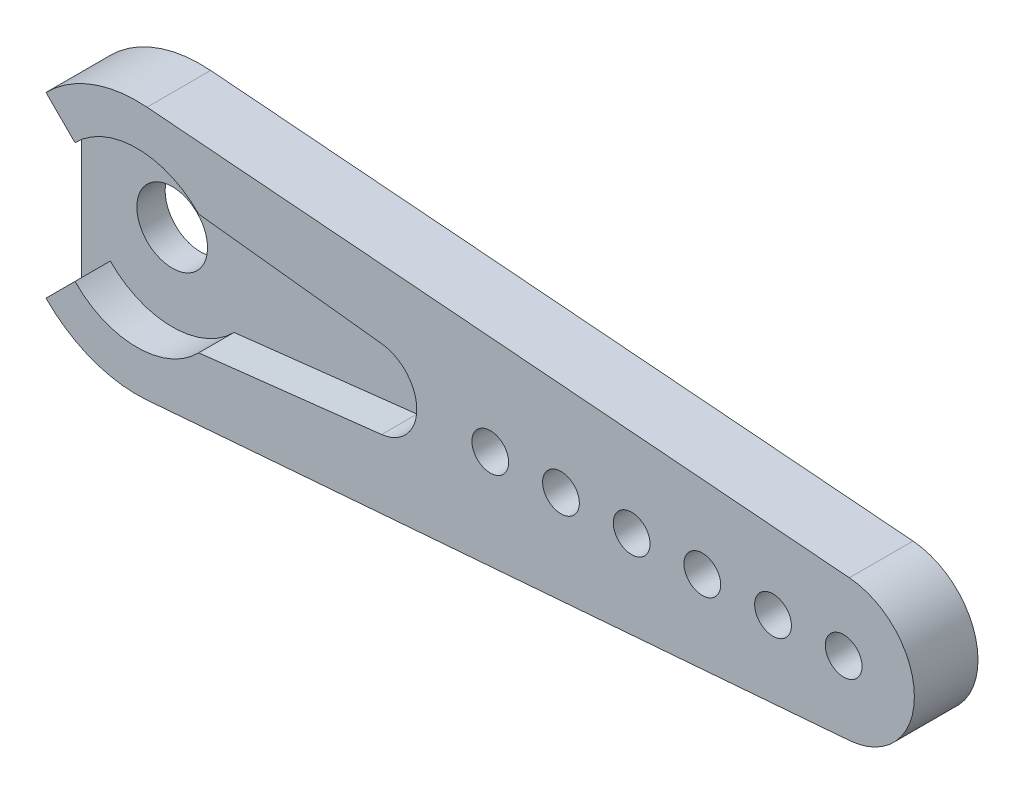
ISO-10303-21;
HEADER;
FILE_DESCRIPTION(('STEP AP214'),'2;1');
FILE_NAME('part.step','',(''),(''),'','','');
FILE_SCHEMA(('AUTOMOTIVE_DESIGN { 1 0 10303 214 1 1 1 1 }'));
ENDSEC;
DATA;
#1=APPLICATION_CONTEXT('core data for automotive mechanical design processes');
#2=APPLICATION_PROTOCOL_DEFINITION('international standard','automotive_design',2000,#1);
#3=PRODUCT_CONTEXT('',#1,'mechanical');
#4=PRODUCT('Part','Part','',(#3));
#5=PRODUCT_RELATED_PRODUCT_CATEGORY('part','',(#4));
#6=PRODUCT_DEFINITION_FORMATION('','',#4);
#7=PRODUCT_DEFINITION_CONTEXT('part definition',#1,'design');
#8=PRODUCT_DEFINITION('design','',#6,#7);
#9=PRODUCT_DEFINITION_SHAPE('','',#8);
#10=(LENGTH_UNIT() NAMED_UNIT(*) SI_UNIT(.MILLI.,.METRE.));
#11=(NAMED_UNIT(*) PLANE_ANGLE_UNIT() SI_UNIT($,.RADIAN.));
#12=(NAMED_UNIT(*) SI_UNIT($,.STERADIAN.) SOLID_ANGLE_UNIT());
#13=UNCERTAINTY_MEASURE_WITH_UNIT(LENGTH_MEASURE(1.E-05),#10,'distance_accuracy_value','');
#14=(GEOMETRIC_REPRESENTATION_CONTEXT(3) GLOBAL_UNCERTAINTY_ASSIGNED_CONTEXT((#13)) GLOBAL_UNIT_ASSIGNED_CONTEXT((#10,
#11,#12)) REPRESENTATION_CONTEXT('',''));
#15=CARTESIAN_POINT('',(0.,0.,0.));
#16=DIRECTION('',(0.,0.,1.));
#17=DIRECTION('',(1.,0.,0.));
#18=AXIS2_PLACEMENT_3D('',#15,#16,#17);
#19=CARTESIAN_POINT('',(25.,0.,-2.));
#20=DIRECTION('',(0.,0.,1.));
#21=DIRECTION('',(1.,0.,0.));
#22=AXIS2_PLACEMENT_3D('',#19,#20,#21);
#23=CYLINDRICAL_SURFACE('',#22,1.3);
#24=CARTESIAN_POINT('',(25.,0.,-2.));
#25=DIRECTION('',(0.,0.,1.));
#26=DIRECTION('',(1.,0.,0.));
#27=AXIS2_PLACEMENT_3D('',#24,#25,#26);
#28=CIRCLE('',#27,1.3);
#29=CARTESIAN_POINT('',(26.3,0.,-2.));
#30=VERTEX_POINT('',#29);
#31=EDGE_CURVE('E41',#30,#30,#28,.T.);
#32=ORIENTED_EDGE('',*,*,#31,.F.);
#33=EDGE_LOOP('',(#32));
#34=FACE_BOUND('',#33,.T.);
#35=CARTESIAN_POINT('',(25.,0.,2.5));
#36=DIRECTION('',(0.,0.,1.));
#37=DIRECTION('',(1.,0.,0.));
#38=AXIS2_PLACEMENT_3D('',#35,#36,#37);
#39=CIRCLE('',#38,1.3);
#40=CARTESIAN_POINT('',(26.3,0.,2.5));
#41=VERTEX_POINT('',#40);
#42=EDGE_CURVE('E11',#41,#41,#39,.T.);
#43=ORIENTED_EDGE('',*,*,#42,.T.);
#44=EDGE_LOOP('',(#43));
#45=FACE_BOUND('',#44,.T.);
#46=ADVANCED_FACE('F33',(#34,#45),#23,.F.);
#47=CARTESIAN_POINT('',(30.,0.,-2.));
#48=DIRECTION('',(0.,0.,1.));
#49=DIRECTION('',(1.,0.,0.));
#50=AXIS2_PLACEMENT_3D('',#47,#48,#49);
#51=CYLINDRICAL_SURFACE('',#50,1.3);
#52=CARTESIAN_POINT('',(30.,0.,-2.));
#53=DIRECTION('',(0.,0.,1.));
#54=DIRECTION('',(1.,0.,0.));
#55=AXIS2_PLACEMENT_3D('',#52,#53,#54);
#56=CIRCLE('',#55,1.3);
#57=CARTESIAN_POINT('',(31.3,0.,-2.));
#58=VERTEX_POINT('',#57);
#59=EDGE_CURVE('E243',#58,#58,#56,.T.);
#60=ORIENTED_EDGE('',*,*,#59,.F.);
#61=EDGE_LOOP('',(#60));
#62=FACE_BOUND('',#61,.T.);
#63=CARTESIAN_POINT('',(30.,0.,2.5));
#64=DIRECTION('',(0.,0.,1.));
#65=DIRECTION('',(1.,0.,0.));
#66=AXIS2_PLACEMENT_3D('',#63,#64,#65);
#67=CIRCLE('',#66,1.3);
#68=CARTESIAN_POINT('',(31.3,0.,2.5));
#69=VERTEX_POINT('',#68);
#70=EDGE_CURVE('E246',#69,#69,#67,.T.);
#71=ORIENTED_EDGE('',*,*,#70,.T.);
#72=EDGE_LOOP('',(#71));
#73=FACE_BOUND('',#72,.T.);
#74=ADVANCED_FACE('F254',(#62,#73),#51,.F.);
#75=CARTESIAN_POINT('',(35.,0.,-2.));
#76=DIRECTION('',(0.,0.,1.));
#77=DIRECTION('',(1.,0.,0.));
#78=AXIS2_PLACEMENT_3D('',#75,#76,#77);
#79=CYLINDRICAL_SURFACE('',#78,1.3);
#80=CARTESIAN_POINT('',(35.,0.,-2.));
#81=DIRECTION('',(0.,0.,1.));
#82=DIRECTION('',(1.,0.,0.));
#83=AXIS2_PLACEMENT_3D('',#80,#81,#82);
#84=CIRCLE('',#83,1.3);
#85=CARTESIAN_POINT('',(36.3,0.,-2.));
#86=VERTEX_POINT('',#85);
#87=EDGE_CURVE('E237',#86,#86,#84,.T.);
#88=ORIENTED_EDGE('',*,*,#87,.F.);
#89=EDGE_LOOP('',(#88));
#90=FACE_BOUND('',#89,.T.);
#91=CARTESIAN_POINT('',(35.,0.,2.5));
#92=DIRECTION('',(0.,0.,1.));
#93=DIRECTION('',(1.,0.,0.));
#94=AXIS2_PLACEMENT_3D('',#91,#92,#93);
#95=CIRCLE('',#94,1.3);
#96=CARTESIAN_POINT('',(36.3,0.,2.5));
#97=VERTEX_POINT('',#96);
#98=EDGE_CURVE('E240',#97,#97,#95,.T.);
#99=ORIENTED_EDGE('',*,*,#98,.T.);
#100=EDGE_LOOP('',(#99));
#101=FACE_BOUND('',#100,.T.);
#102=ADVANCED_FACE('F321',(#90,#101),#79,.F.);
#103=CARTESIAN_POINT('',(40.,0.,-2.));
#104=DIRECTION('',(0.,0.,1.));
#105=DIRECTION('',(1.,0.,0.));
#106=AXIS2_PLACEMENT_3D('',#103,#104,#105);
#107=CYLINDRICAL_SURFACE('',#106,1.3);
#108=CARTESIAN_POINT('',(40.,0.,-2.));
#109=DIRECTION('',(0.,0.,1.));
#110=DIRECTION('',(1.,0.,0.));
#111=AXIS2_PLACEMENT_3D('',#108,#109,#110);
#112=CIRCLE('',#111,1.3);
#113=CARTESIAN_POINT('',(41.3,0.,-2.));
#114=VERTEX_POINT('',#113);
#115=EDGE_CURVE('E231',#114,#114,#112,.T.);
#116=ORIENTED_EDGE('',*,*,#115,.F.);
#117=EDGE_LOOP('',(#116));
#118=FACE_BOUND('',#117,.T.);
#119=CARTESIAN_POINT('',(40.,0.,2.5));
#120=DIRECTION('',(0.,0.,1.));
#121=DIRECTION('',(1.,0.,0.));
#122=AXIS2_PLACEMENT_3D('',#119,#120,#121);
#123=CIRCLE('',#122,1.3);
#124=CARTESIAN_POINT('',(41.3,0.,2.5));
#125=VERTEX_POINT('',#124);
#126=EDGE_CURVE('E234',#125,#125,#123,.T.);
#127=ORIENTED_EDGE('',*,*,#126,.T.);
#128=EDGE_LOOP('',(#127));
#129=FACE_BOUND('',#128,.T.);
#130=ADVANCED_FACE('F318',(#118,#129),#107,.F.);
#131=CARTESIAN_POINT('',(0.,0.,2.5));
#132=DIRECTION('',(0.,0.,-1.));
#133=DIRECTION('',(-1.,0.,0.));
#134=AXIS2_PLACEMENT_3D('',#131,#132,#133);
#135=CYLINDRICAL_SURFACE('',#134,9.);
#136=DIRECTION('',(0.,0.,-1.));
#137=VECTOR('',#136,1.);
#138=CARTESIAN_POINT('',(0.719999999999999,8.97115377195152,2.5));
#139=LINE('',#138,#137);
#140=CARTESIAN_POINT('',(0.719999999999999,8.97115377195152,2.5));
#141=VERTEX_POINT('',#140);
#142=CARTESIAN_POINT('',(0.719999999999999,8.97115377195152,-2.));
#143=VERTEX_POINT('',#142);
#144=EDGE_CURVE('E185',#141,#143,#139,.T.);
#145=ORIENTED_EDGE('',*,*,#144,.T.);
#146=CARTESIAN_POINT('',(0.,0.,-2.));
#147=DIRECTION('',(0.,0.,-1.));
#148=DIRECTION('',(-1.,0.,0.));
#149=AXIS2_PLACEMENT_3D('',#146,#147,#148);
#150=CIRCLE('',#149,9.);
#151=CARTESIAN_POINT('',(-6.42654307097902,6.30075742723457,-2.));
#152=VERTEX_POINT('',#151);
#153=EDGE_CURVE('E135',#152,#143,#150,.T.);
#154=ORIENTED_EDGE('',*,*,#153,.F.);
#155=DIRECTION('',(0.,0.,1.));
#156=VECTOR('',#155,1.);
#157=CARTESIAN_POINT('',(-6.42654307097902,6.30075742723457,-2.));
#158=LINE('',#157,#156);
#159=CARTESIAN_POINT('',(-6.42654307097902,6.30075742723457,0.));
#160=VERTEX_POINT('',#159);
#161=EDGE_CURVE('E131',#152,#160,#158,.T.);
#162=ORIENTED_EDGE('',*,*,#161,.T.);
#163=DIRECTION('',(0.,0.,-1.));
#164=VECTOR('',#163,1.);
#165=CARTESIAN_POINT('',(-6.42654307097901,6.30075742723457,2.5));
#166=LINE('',#165,#164);
#167=CARTESIAN_POINT('',(-6.42654307097901,6.30075742723457,2.5));
#168=VERTEX_POINT('',#167);
#169=EDGE_CURVE('E228',#168,#160,#166,.T.);
#170=ORIENTED_EDGE('',*,*,#169,.F.);
#171=CARTESIAN_POINT('',(0.,0.,2.5));
#172=DIRECTION('',(0.,0.,1.));
#173=DIRECTION('',(-1.,0.,0.));
#174=AXIS2_PLACEMENT_3D('',#171,#172,#173);
#175=CIRCLE('',#174,9.);
#176=EDGE_CURVE('E162',#141,#168,#175,.T.);
#177=ORIENTED_EDGE('',*,*,#176,.F.);
#178=EDGE_LOOP('',(#145,#154,#162,#170,#177));
#179=FACE_BOUND('',#178,.T.);
#180=ADVANCED_FACE('F314',(#179),#135,.T.);
#181=CARTESIAN_POINT('',(-4.37578564374445,4.25,2.5));
#182=DIRECTION('',(0.707106781186548,0.707106781186548,0.));
#183=DIRECTION('',(-0.707106781186548,0.707106781186548,0.));
#184=AXIS2_PLACEMENT_3D('',#181,#182,#183);
#185=PLANE('',#184);
#186=DIRECTION('',(0.707106781186548,-0.707106781186548,0.));
#187=VECTOR('',#186,1.);
#188=CARTESIAN_POINT('',(-4.37578564374445,4.25,0.));
#189=LINE('',#188,#187);
#190=CARTESIAN_POINT('',(-4.37578564374445,4.25,0.));
#191=VERTEX_POINT('',#190);
#192=EDGE_CURVE('E154',#160,#191,#189,.T.);
#193=ORIENTED_EDGE('',*,*,#192,.T.);
#194=DIRECTION('',(0.,0.,-1.));
#195=VECTOR('',#194,1.);
#196=CARTESIAN_POINT('',(-4.37578564374445,4.25,2.5));
#197=LINE('',#196,#195);
#198=CARTESIAN_POINT('',(-4.37578564374445,4.25,2.5));
#199=VERTEX_POINT('',#198);
#200=EDGE_CURVE('E225',#199,#191,#197,.T.);
#201=ORIENTED_EDGE('',*,*,#200,.F.);
#202=DIRECTION('',(0.707106781186548,-0.707106781186548,0.));
#203=VECTOR('',#202,1.);
#204=CARTESIAN_POINT('',(-4.37578564374445,4.25,2.5));
#205=LINE('',#204,#203);
#206=EDGE_CURVE('E164',#168,#199,#205,.T.);
#207=ORIENTED_EDGE('',*,*,#206,.F.);
#208=ORIENTED_EDGE('',*,*,#169,.T.);
#209=EDGE_LOOP('',(#193,#201,#207,#208));
#210=FACE_BOUND('',#209,.T.);
#211=ADVANCED_FACE('F310',(#210),#185,.F.);
#212=CARTESIAN_POINT('',(0.,0.,2.5));
#213=DIRECTION('',(0.,0.,-1.));
#214=DIRECTION('',(-1.,0.,0.));
#215=AXIS2_PLACEMENT_3D('',#212,#213,#214);
#216=CYLINDRICAL_SURFACE('',#215,6.1);
#217=CARTESIAN_POINT('',(0.,0.,0.));
#218=DIRECTION('',(0.,0.,-1.));
#219=DIRECTION('',(1.,0.,0.));
#220=AXIS2_PLACEMENT_3D('',#217,#218,#219);
#221=CIRCLE('',#220,6.1);
#222=CARTESIAN_POINT('',(4.37578564374445,4.25,0.));
#223=VERTEX_POINT('',#222);
#224=EDGE_CURVE('E157',#191,#223,#221,.T.);
#225=ORIENTED_EDGE('',*,*,#224,.T.);
#226=DIRECTION('',(0.,0.,-1.));
#227=VECTOR('',#226,1.);
#228=CARTESIAN_POINT('',(4.37578564374445,4.25,2.5));
#229=LINE('',#228,#227);
#230=CARTESIAN_POINT('',(4.37578564374445,4.25,2.5));
#231=VERTEX_POINT('',#230);
#232=EDGE_CURVE('E222',#231,#223,#229,.T.);
#233=ORIENTED_EDGE('',*,*,#232,.F.);
#234=CARTESIAN_POINT('',(0.,0.,2.5));
#235=DIRECTION('',(0.,0.,-1.));
#236=DIRECTION('',(1.,0.,0.));
#237=AXIS2_PLACEMENT_3D('',#234,#235,#236);
#238=CIRCLE('',#237,6.1);
#239=EDGE_CURVE('E167',#199,#231,#238,.T.);
#240=ORIENTED_EDGE('',*,*,#239,.F.);
#241=ORIENTED_EDGE('',*,*,#200,.T.);
#242=EDGE_LOOP('',(#225,#233,#240,#241));
#243=FACE_BOUND('',#242,.T.);
#244=ADVANCED_FACE('F306',(#243),#216,.F.);
#245=CARTESIAN_POINT('',(4.37578564374445,4.25,2.5));
#246=DIRECTION('',(0.112713317991759,0.993627549913592,0.));
#247=DIRECTION('',(-0.993627549913592,0.112713317991759,0.));
#248=AXIS2_PLACEMENT_3D('',#245,#246,#247);
#249=PLANE('',#248);
#250=DIRECTION('',(0.993627549913592,-0.112713317991759,0.));
#251=VECTOR('',#250,1.);
#252=CARTESIAN_POINT('',(4.37578564374445,4.25,0.));
#253=LINE('',#252,#251);
#254=CARTESIAN_POINT('',(17.3155972903769,2.78215713975806,0.));
#255=VERTEX_POINT('',#254);
#256=EDGE_CURVE('E189',#223,#255,#253,.T.);
#257=ORIENTED_EDGE('',*,*,#256,.T.);
#258=DIRECTION('',(0.,0.,-1.));
#259=VECTOR('',#258,1.);
#260=CARTESIAN_POINT('',(17.3155972903769,2.78215713975806,2.5));
#261=LINE('',#260,#259);
#262=CARTESIAN_POINT('',(17.3155972903769,2.78215713975806,2.5));
#263=VERTEX_POINT('',#262);
#264=EDGE_CURVE('E219',#263,#255,#261,.T.);
#265=ORIENTED_EDGE('',*,*,#264,.F.);
#266=DIRECTION('',(0.993627549913592,-0.112713317991759,0.));
#267=VECTOR('',#266,1.);
#268=CARTESIAN_POINT('',(4.37578564374445,4.25,2.5));
#269=LINE('',#268,#267);
#270=EDGE_CURVE('E169',#231,#263,#269,.T.);
#271=ORIENTED_EDGE('',*,*,#270,.F.);
#272=ORIENTED_EDGE('',*,*,#232,.T.);
#273=EDGE_LOOP('',(#257,#265,#271,#272));
#274=FACE_BOUND('',#273,.T.);
#275=ADVANCED_FACE('F302',(#274),#249,.F.);
#276=CARTESIAN_POINT('',(17.,0.,2.5));
#277=DIRECTION('',(0.,0.,-1.));
#278=DIRECTION('',(-1.,0.,0.));
#279=AXIS2_PLACEMENT_3D('',#276,#277,#278);
#280=CYLINDRICAL_SURFACE('',#279,2.8);
#281=CARTESIAN_POINT('',(17.,0.,0.));
#282=DIRECTION('',(0.,0.,-1.));
#283=DIRECTION('',(1.,0.,0.));
#284=AXIS2_PLACEMENT_3D('',#281,#282,#283);
#285=CIRCLE('',#284,2.8);
#286=CARTESIAN_POINT('',(17.3155972903769,-2.78215713975806,0.));
#287=VERTEX_POINT('',#286);
#288=EDGE_CURVE('E192',#255,#287,#285,.T.);
#289=ORIENTED_EDGE('',*,*,#288,.T.);
#290=DIRECTION('',(0.,0.,-1.));
#291=VECTOR('',#290,1.);
#292=CARTESIAN_POINT('',(17.3155972903769,-2.78215713975806,2.5));
#293=LINE('',#292,#291);
#294=CARTESIAN_POINT('',(17.3155972903769,-2.78215713975806,2.5));
#295=VERTEX_POINT('',#294);
#296=EDGE_CURVE('E216',#295,#287,#293,.T.);
#297=ORIENTED_EDGE('',*,*,#296,.F.);
#298=CARTESIAN_POINT('',(17.,0.,2.5));
#299=DIRECTION('',(0.,0.,-1.));
#300=DIRECTION('',(1.,0.,0.));
#301=AXIS2_PLACEMENT_3D('',#298,#299,#300);
#302=CIRCLE('',#301,2.8);
#303=EDGE_CURVE('E171',#263,#295,#302,.T.);
#304=ORIENTED_EDGE('',*,*,#303,.F.);
#305=ORIENTED_EDGE('',*,*,#264,.T.);
#306=EDGE_LOOP('',(#289,#297,#304,#305));
#307=FACE_BOUND('',#306,.T.);
#308=ADVANCED_FACE('F298',(#307),#280,.F.);
#309=CARTESIAN_POINT('',(17.3155972903769,-2.78215713975806,2.5));
#310=DIRECTION('',(0.112713317991759,-0.993627549913592,0.));
#311=DIRECTION('',(0.993627549913592,0.112713317991759,0.));
#312=AXIS2_PLACEMENT_3D('',#309,#310,#311);
#313=PLANE('',#312);
#314=DIRECTION('',(-0.993627549913592,-0.112713317991759,0.));
#315=VECTOR('',#314,1.);
#316=CARTESIAN_POINT('',(17.3155972903769,-2.78215713975806,0.));
#317=LINE('',#316,#315);
#318=CARTESIAN_POINT('',(4.37578564374445,-4.25,0.));
#319=VERTEX_POINT('',#318);
#320=EDGE_CURVE('E195',#287,#319,#317,.T.);
#321=ORIENTED_EDGE('',*,*,#320,.T.);
#322=DIRECTION('',(0.,0.,-1.));
#323=VECTOR('',#322,1.);
#324=CARTESIAN_POINT('',(4.37578564374445,-4.25,2.5));
#325=LINE('',#324,#323);
#326=CARTESIAN_POINT('',(4.37578564374445,-4.25,2.5));
#327=VERTEX_POINT('',#326);
#328=EDGE_CURVE('E213',#327,#319,#325,.T.);
#329=ORIENTED_EDGE('',*,*,#328,.F.);
#330=DIRECTION('',(-0.993627549913592,-0.112713317991759,0.));
#331=VECTOR('',#330,1.);
#332=CARTESIAN_POINT('',(17.3155972903769,-2.78215713975806,2.5));
#333=LINE('',#332,#331);
#334=EDGE_CURVE('E173',#295,#327,#333,.T.);
#335=ORIENTED_EDGE('',*,*,#334,.F.);
#336=ORIENTED_EDGE('',*,*,#296,.T.);
#337=EDGE_LOOP('',(#321,#329,#335,#336));
#338=FACE_BOUND('',#337,.T.);
#339=ADVANCED_FACE('F294',(#338),#313,.F.);
#340=CARTESIAN_POINT('',(0.,0.,2.5));
#341=DIRECTION('',(0.,0.,-1.));
#342=DIRECTION('',(-1.,0.,0.));
#343=AXIS2_PLACEMENT_3D('',#340,#341,#342);
#344=CYLINDRICAL_SURFACE('',#343,6.1);
#345=CARTESIAN_POINT('',(0.,0.,0.));
#346=DIRECTION('',(0.,0.,-1.));
#347=DIRECTION('',(-1.,0.,0.));
#348=AXIS2_PLACEMENT_3D('',#345,#346,#347);
#349=CIRCLE('',#348,6.1);
#350=CARTESIAN_POINT('',(-4.37578564374444,-4.25,0.));
#351=VERTEX_POINT('',#350);
#352=EDGE_CURVE('E198',#319,#351,#349,.T.);
#353=ORIENTED_EDGE('',*,*,#352,.T.);
#354=DIRECTION('',(0.,0.,-1.));
#355=VECTOR('',#354,1.);
#356=CARTESIAN_POINT('',(-4.37578564374444,-4.25,2.5));
#357=LINE('',#356,#355);
#358=CARTESIAN_POINT('',(-4.37578564374444,-4.25,2.5));
#359=VERTEX_POINT('',#358);
#360=EDGE_CURVE('E210',#359,#351,#357,.T.);
#361=ORIENTED_EDGE('',*,*,#360,.F.);
#362=CARTESIAN_POINT('',(0.,0.,2.5));
#363=DIRECTION('',(0.,0.,-1.));
#364=DIRECTION('',(-1.,0.,0.));
#365=AXIS2_PLACEMENT_3D('',#362,#363,#364);
#366=CIRCLE('',#365,6.1);
#367=EDGE_CURVE('E175',#327,#359,#366,.T.);
#368=ORIENTED_EDGE('',*,*,#367,.F.);
#369=ORIENTED_EDGE('',*,*,#328,.T.);
#370=EDGE_LOOP('',(#353,#361,#368,#369));
#371=FACE_BOUND('',#370,.T.);
#372=ADVANCED_FACE('F290',(#371),#344,.F.);
#373=CARTESIAN_POINT('',(-4.37578564374445,-4.25,2.5));
#374=DIRECTION('',(0.707106781186548,-0.707106781186548,0.));
#375=DIRECTION('',(0.707106781186548,0.707106781186548,0.));
#376=AXIS2_PLACEMENT_3D('',#373,#374,#375);
#377=PLANE('',#376);
#378=DIRECTION('',(-0.707106781186548,-0.707106781186548,0.));
#379=VECTOR('',#378,1.);
#380=CARTESIAN_POINT('',(-4.37578564374445,-4.25,0.));
#381=LINE('',#380,#379);
#382=CARTESIAN_POINT('',(-6.42654307097901,-6.30075742723457,0.));
#383=VERTEX_POINT('',#382);
#384=EDGE_CURVE('E165',#351,#383,#381,.T.);
#385=ORIENTED_EDGE('',*,*,#384,.T.);
#386=DIRECTION('',(0.,0.,-1.));
#387=VECTOR('',#386,1.);
#388=CARTESIAN_POINT('',(-6.42654307097901,-6.30075742723457,2.5));
#389=LINE('',#388,#387);
#390=CARTESIAN_POINT('',(-6.42654307097901,-6.30075742723457,2.5));
#391=VERTEX_POINT('',#390);
#392=EDGE_CURVE('E153',#391,#383,#389,.T.);
#393=ORIENTED_EDGE('',*,*,#392,.F.);
#394=DIRECTION('',(-0.707106781186548,-0.707106781186548,0.));
#395=VECTOR('',#394,1.);
#396=CARTESIAN_POINT('',(-4.37578564374445,-4.25,2.5));
#397=LINE('',#396,#395);
#398=EDGE_CURVE('E177',#359,#391,#397,.T.);
#399=ORIENTED_EDGE('',*,*,#398,.F.);
#400=ORIENTED_EDGE('',*,*,#360,.T.);
#401=EDGE_LOOP('',(#385,#393,#399,#400));
#402=FACE_BOUND('',#401,.T.);
#403=ADVANCED_FACE('F287',(#402),#377,.F.);
#404=CARTESIAN_POINT('',(0.,0.,2.5));
#405=DIRECTION('',(0.,0.,-1.));
#406=DIRECTION('',(-1.,0.,0.));
#407=AXIS2_PLACEMENT_3D('',#404,#405,#406);
#408=CYLINDRICAL_SURFACE('',#407,9.);
#409=ORIENTED_EDGE('',*,*,#392,.T.);
#410=DIRECTION('',(0.,0.,1.));
#411=VECTOR('',#410,1.);
#412=CARTESIAN_POINT('',(-6.42654307097901,-6.30075742723457,-2.));
#413=LINE('',#412,#411);
#414=CARTESIAN_POINT('',(-6.42654307097901,-6.30075742723457,-2.));
#415=VERTEX_POINT('',#414);
#416=EDGE_CURVE('E128',#415,#383,#413,.T.);
#417=ORIENTED_EDGE('',*,*,#416,.F.);
#418=CARTESIAN_POINT('',(0.,0.,-2.));
#419=DIRECTION('',(0.,0.,-1.));
#420=DIRECTION('',(-1.,0.,0.));
#421=AXIS2_PLACEMENT_3D('',#418,#419,#420);
#422=CIRCLE('',#421,9.);
#423=CARTESIAN_POINT('',(0.72,-8.97115377195152,-2.));
#424=VERTEX_POINT('',#423);
#425=EDGE_CURVE('E136',#424,#415,#422,.T.);
#426=ORIENTED_EDGE('',*,*,#425,.F.);
#427=DIRECTION('',(0.,0.,-1.));
#428=VECTOR('',#427,1.);
#429=CARTESIAN_POINT('',(0.719999999999997,-8.97115377195152,2.5));
#430=LINE('',#429,#428);
#431=CARTESIAN_POINT('',(0.719999999999997,-8.97115377195152,2.5));
#432=VERTEX_POINT('',#431);
#433=EDGE_CURVE('E207',#432,#424,#430,.T.);
#434=ORIENTED_EDGE('',*,*,#433,.F.);
#435=CARTESIAN_POINT('',(0.,0.,2.5));
#436=DIRECTION('',(0.,0.,1.));
#437=DIRECTION('',(1.,0.,0.));
#438=AXIS2_PLACEMENT_3D('',#435,#436,#437);
#439=CIRCLE('',#438,9.);
#440=EDGE_CURVE('E179',#391,#432,#439,.T.);
#441=ORIENTED_EDGE('',*,*,#440,.F.);
#442=EDGE_LOOP('',(#409,#417,#426,#434,#441));
#443=FACE_BOUND('',#442,.T.);
#444=ADVANCED_FACE('F150',(#443),#408,.T.);
#445=CARTESIAN_POINT('',(0.72,-8.97115377195152,2.5));
#446=DIRECTION('',(-0.08,0.996794863550169,0.));
#447=DIRECTION('',(-0.996794863550169,-0.08,0.));
#448=AXIS2_PLACEMENT_3D('',#445,#446,#447);
#449=PLANE('',#448);
#450=ORIENTED_EDGE('',*,*,#433,.T.);
#451=DIRECTION('',(-0.996794863550169,-0.08,0.));
#452=VECTOR('',#451,1.);
#453=CARTESIAN_POINT('',(0.72,-8.97115377195152,-2.));
#454=LINE('',#453,#452);
#455=CARTESIAN_POINT('',(50.4,-4.98397431775085,-2.));
#456=VERTEX_POINT('',#455);
#457=EDGE_CURVE('E144',#456,#424,#454,.T.);
#458=ORIENTED_EDGE('',*,*,#457,.F.);
#459=DIRECTION('',(0.,0.,-1.));
#460=VECTOR('',#459,1.);
#461=CARTESIAN_POINT('',(50.4,-4.98397431775085,2.5));
#462=LINE('',#461,#460);
#463=CARTESIAN_POINT('',(50.4,-4.98397431775085,2.5));
#464=VERTEX_POINT('',#463);
#465=EDGE_CURVE('E205',#464,#456,#462,.T.);
#466=ORIENTED_EDGE('',*,*,#465,.F.);
#467=DIRECTION('',(0.996794863550169,0.08,0.));
#468=VECTOR('',#467,1.);
#469=CARTESIAN_POINT('',(0.72,-8.97115377195152,2.5));
#470=LINE('',#469,#468);
#471=EDGE_CURVE('E181',#432,#464,#470,.T.);
#472=ORIENTED_EDGE('',*,*,#471,.F.);
#473=EDGE_LOOP('',(#450,#458,#466,#472));
#474=FACE_BOUND('',#473,.T.);
#475=ADVANCED_FACE('F280',(#474),#449,.F.);
#476=CARTESIAN_POINT('',(50.,0.,2.5));
#477=DIRECTION('',(0.,0.,-1.));
#478=DIRECTION('',(-1.,0.,0.));
#479=AXIS2_PLACEMENT_3D('',#476,#477,#478);
#480=CYLINDRICAL_SURFACE('',#479,5.);
#481=ORIENTED_EDGE('',*,*,#465,.T.);
#482=CARTESIAN_POINT('',(50.,0.,-2.));
#483=DIRECTION('',(0.,0.,-1.));
#484=DIRECTION('',(-1.,0.,0.));
#485=AXIS2_PLACEMENT_3D('',#482,#483,#484);
#486=CIRCLE('',#485,5.);
#487=CARTESIAN_POINT('',(50.4,4.98397431775085,-2.));
#488=VERTEX_POINT('',#487);
#489=EDGE_CURVE('E435',#488,#456,#486,.T.);
#490=ORIENTED_EDGE('',*,*,#489,.F.);
#491=DIRECTION('',(0.,0.,-1.));
#492=VECTOR('',#491,1.);
#493=CARTESIAN_POINT('',(50.4,4.98397431775085,2.5));
#494=LINE('',#493,#492);
#495=CARTESIAN_POINT('',(50.4,4.98397431775085,2.5));
#496=VERTEX_POINT('',#495);
#497=EDGE_CURVE('E203',#496,#488,#494,.T.);
#498=ORIENTED_EDGE('',*,*,#497,.F.);
#499=CARTESIAN_POINT('',(50.,0.,2.5));
#500=DIRECTION('',(0.,0.,1.));
#501=DIRECTION('',(-1.,0.,0.));
#502=AXIS2_PLACEMENT_3D('',#499,#500,#501);
#503=CIRCLE('',#502,5.);
#504=EDGE_CURVE('E183',#464,#496,#503,.T.);
#505=ORIENTED_EDGE('',*,*,#504,.F.);
#506=EDGE_LOOP('',(#481,#490,#498,#505));
#507=FACE_BOUND('',#506,.T.);
#508=ADVANCED_FACE('F270',(#507),#480,.T.);
#509=CARTESIAN_POINT('',(0.719999999999999,8.97115377195152,2.5));
#510=DIRECTION('',(-0.08,-0.996794863550169,0.));
#511=DIRECTION('',(0.996794863550169,-0.08,0.));
#512=AXIS2_PLACEMENT_3D('',#509,#510,#511);
#513=PLANE('',#512);
#514=ORIENTED_EDGE('',*,*,#497,.T.);
#515=DIRECTION('',(0.996794863550169,-0.08,0.));
#516=VECTOR('',#515,1.);
#517=CARTESIAN_POINT('',(0.719999999999999,8.97115377195152,-2.));
#518=LINE('',#517,#516);
#519=EDGE_CURVE('E432',#143,#488,#518,.T.);
#520=ORIENTED_EDGE('',*,*,#519,.F.);
#521=ORIENTED_EDGE('',*,*,#144,.F.);
#522=DIRECTION('',(-0.996794863550169,0.08,0.));
#523=VECTOR('',#522,1.);
#524=CARTESIAN_POINT('',(0.719999999999999,8.97115377195152,2.5));
#525=LINE('',#524,#523);
#526=EDGE_CURVE('E48',#496,#141,#525,.T.);
#527=ORIENTED_EDGE('',*,*,#526,.F.);
#528=EDGE_LOOP('',(#514,#520,#521,#527));
#529=FACE_BOUND('',#528,.T.);
#530=ADVANCED_FACE('F259',(#529),#513,.F.);
#531=CARTESIAN_POINT('',(0.,0.,2.5));
#532=DIRECTION('',(0.,0.,-1.));
#533=DIRECTION('',(-1.,0.,0.));
#534=AXIS2_PLACEMENT_3D('',#531,#532,#533);
#535=PLANE('',#534);
#536=CARTESIAN_POINT('',(45.,0.,2.5));
#537=DIRECTION('',(0.,0.,1.));
#538=DIRECTION('',(1.,0.,0.));
#539=AXIS2_PLACEMENT_3D('',#536,#537,#538);
#540=CIRCLE('',#539,1.3);
#541=CARTESIAN_POINT('',(46.3,0.,2.5));
#542=VERTEX_POINT('',#541);
#543=EDGE_CURVE('E418',#542,#542,#540,.T.);
#544=ORIENTED_EDGE('',*,*,#543,.F.);
#545=EDGE_LOOP('',(#544));
#546=FACE_BOUND('',#545,.T.);
#547=CARTESIAN_POINT('',(50.,0.,2.5));
#548=DIRECTION('',(0.,0.,1.));
#549=DIRECTION('',(1.,0.,0.));
#550=AXIS2_PLACEMENT_3D('',#547,#548,#549);
#551=CIRCLE('',#550,1.3);
#552=CARTESIAN_POINT('',(51.3,0.,2.5));
#553=VERTEX_POINT('',#552);
#554=EDGE_CURVE('E417',#553,#553,#551,.T.);
#555=ORIENTED_EDGE('',*,*,#554,.F.);
#556=EDGE_LOOP('',(#555));
#557=FACE_BOUND('',#556,.T.);
#558=ORIENTED_EDGE('',*,*,#176,.T.);
#559=ORIENTED_EDGE('',*,*,#206,.T.);
#560=ORIENTED_EDGE('',*,*,#239,.T.);
#561=ORIENTED_EDGE('',*,*,#270,.T.);
#562=ORIENTED_EDGE('',*,*,#303,.T.);
#563=ORIENTED_EDGE('',*,*,#334,.T.);
#564=ORIENTED_EDGE('',*,*,#367,.T.);
#565=ORIENTED_EDGE('',*,*,#398,.T.);
#566=ORIENTED_EDGE('',*,*,#440,.T.);
#567=ORIENTED_EDGE('',*,*,#471,.T.);
#568=ORIENTED_EDGE('',*,*,#504,.T.);
#569=ORIENTED_EDGE('',*,*,#526,.T.);
#570=EDGE_LOOP('',(#558,#559,#560,#561,#562,#563,#564,#565,#566,#567,#568,#569));
#571=FACE_BOUND('',#570,.T.);
#572=ORIENTED_EDGE('',*,*,#126,.F.);
#573=EDGE_LOOP('',(#572));
#574=FACE_BOUND('',#573,.T.);
#575=ORIENTED_EDGE('',*,*,#98,.F.);
#576=EDGE_LOOP('',(#575));
#577=FACE_BOUND('',#576,.T.);
#578=ORIENTED_EDGE('',*,*,#70,.F.);
#579=EDGE_LOOP('',(#578));
#580=FACE_BOUND('',#579,.T.);
#581=ORIENTED_EDGE('',*,*,#42,.F.);
#582=EDGE_LOOP('',(#581));
#583=FACE_BOUND('',#582,.T.);
#584=ADVANCED_FACE('F257',(#546,#557,#571,#574,#577,#580,#583),#535,.F.);
#585=CARTESIAN_POINT('',(0.,0.,-2.));
#586=DIRECTION('',(0.,0.,-1.));
#587=DIRECTION('',(-1.,0.,0.));
#588=AXIS2_PLACEMENT_3D('',#585,#586,#587);
#589=PLANE('',#588);
#590=CARTESIAN_POINT('',(45.,0.,-2.));
#591=DIRECTION('',(0.,0.,1.));
#592=DIRECTION('',(1.,0.,0.));
#593=AXIS2_PLACEMENT_3D('',#590,#591,#592);
#594=CIRCLE('',#593,1.3);
#595=CARTESIAN_POINT('',(46.3,0.,-2.));
#596=VERTEX_POINT('',#595);
#597=EDGE_CURVE('E423',#596,#596,#594,.T.);
#598=ORIENTED_EDGE('',*,*,#597,.T.);
#599=EDGE_LOOP('',(#598));
#600=FACE_BOUND('',#599,.T.);
#601=CARTESIAN_POINT('',(50.,0.,-2.));
#602=DIRECTION('',(0.,0.,1.));
#603=DIRECTION('',(1.,0.,0.));
#604=AXIS2_PLACEMENT_3D('',#601,#602,#603);
#605=CIRCLE('',#604,1.3);
#606=CARTESIAN_POINT('',(51.3,0.,-2.));
#607=VERTEX_POINT('',#606);
#608=EDGE_CURVE('E414',#607,#607,#605,.T.);
#609=ORIENTED_EDGE('',*,*,#608,.T.);
#610=EDGE_LOOP('',(#609));
#611=FACE_BOUND('',#610,.T.);
#612=ORIENTED_EDGE('',*,*,#425,.T.);
#613=DIRECTION('',(0.,1.,0.));
#614=VECTOR('',#613,1.);
#615=CARTESIAN_POINT('',(-6.42654307097901,-6.30075742723457,-2.));
#616=LINE('',#615,#614);
#617=EDGE_CURVE('E123',#415,#152,#616,.T.);
#618=ORIENTED_EDGE('',*,*,#617,.T.);
#619=ORIENTED_EDGE('',*,*,#153,.T.);
#620=ORIENTED_EDGE('',*,*,#519,.T.);
#621=ORIENTED_EDGE('',*,*,#489,.T.);
#622=ORIENTED_EDGE('',*,*,#457,.T.);
#623=EDGE_LOOP('',(#612,#618,#619,#620,#621,#622));
#624=FACE_BOUND('',#623,.T.);
#625=CARTESIAN_POINT('',(0.,0.,-2.));
#626=DIRECTION('',(0.,0.,-1.));
#627=DIRECTION('',(-1.,0.,0.));
#628=AXIS2_PLACEMENT_3D('',#625,#626,#627);
#629=CIRCLE('',#628,2.5);
#630=CARTESIAN_POINT('',(-2.5,0.,-2.));
#631=VERTEX_POINT('',#630);
#632=EDGE_CURVE('E426',#631,#631,#629,.T.);
#633=ORIENTED_EDGE('',*,*,#632,.F.);
#634=EDGE_LOOP('',(#633));
#635=FACE_BOUND('',#634,.T.);
#636=ORIENTED_EDGE('',*,*,#115,.T.);
#637=EDGE_LOOP('',(#636));
#638=FACE_BOUND('',#637,.T.);
#639=ORIENTED_EDGE('',*,*,#87,.T.);
#640=EDGE_LOOP('',(#639));
#641=FACE_BOUND('',#640,.T.);
#642=ORIENTED_EDGE('',*,*,#59,.T.);
#643=EDGE_LOOP('',(#642));
#644=FACE_BOUND('',#643,.T.);
#645=ORIENTED_EDGE('',*,*,#31,.T.);
#646=EDGE_LOOP('',(#645));
#647=FACE_BOUND('',#646,.T.);
#648=ADVANCED_FACE('F140',(#600,#611,#624,#635,#638,#641,#644,#647),#589,.T.);
#649=CARTESIAN_POINT('',(0.,0.,0.));
#650=DIRECTION('',(0.,0.,-1.));
#651=DIRECTION('',(-1.,0.,0.));
#652=AXIS2_PLACEMENT_3D('',#649,#650,#651);
#653=PLANE('',#652);
#654=ORIENTED_EDGE('',*,*,#384,.F.);
#655=ORIENTED_EDGE('',*,*,#352,.F.);
#656=ORIENTED_EDGE('',*,*,#320,.F.);
#657=ORIENTED_EDGE('',*,*,#288,.F.);
#658=ORIENTED_EDGE('',*,*,#256,.F.);
#659=ORIENTED_EDGE('',*,*,#224,.F.);
#660=ORIENTED_EDGE('',*,*,#192,.F.);
#661=DIRECTION('',(0.,1.,0.));
#662=VECTOR('',#661,1.);
#663=CARTESIAN_POINT('',(-6.42654307097901,-6.30075742723457,0.));
#664=LINE('',#663,#662);
#665=EDGE_CURVE('E147',#383,#160,#664,.T.);
#666=ORIENTED_EDGE('',*,*,#665,.F.);
#667=EDGE_LOOP('',(#654,#655,#656,#657,#658,#659,#660,#666));
#668=FACE_BOUND('',#667,.T.);
#669=CARTESIAN_POINT('',(0.,0.,0.));
#670=DIRECTION('',(0.,0.,-1.));
#671=DIRECTION('',(-1.,0.,0.));
#672=AXIS2_PLACEMENT_3D('',#669,#670,#671);
#673=CIRCLE('',#672,2.5);
#674=CARTESIAN_POINT('',(-2.5,0.,0.));
#675=VERTEX_POINT('',#674);
#676=EDGE_CURVE('E420',#675,#675,#673,.T.);
#677=ORIENTED_EDGE('',*,*,#676,.T.);
#678=EDGE_LOOP('',(#677));
#679=FACE_BOUND('',#678,.T.);
#680=ADVANCED_FACE('F266',(#668,#679),#653,.F.);
#681=CARTESIAN_POINT('',(-6.42654307097901,-6.30075742723457,-2.));
#682=DIRECTION('',(1.,0.,0.));
#683=DIRECTION('',(0.,0.,-1.));
#684=AXIS2_PLACEMENT_3D('',#681,#682,#683);
#685=PLANE('',#684);
#686=ORIENTED_EDGE('',*,*,#665,.T.);
#687=ORIENTED_EDGE('',*,*,#161,.F.);
#688=ORIENTED_EDGE('',*,*,#617,.F.);
#689=ORIENTED_EDGE('',*,*,#416,.T.);
#690=EDGE_LOOP('',(#686,#687,#688,#689));
#691=FACE_BOUND('',#690,.T.);
#692=ADVANCED_FACE('F126',(#691),#685,.F.);
#693=CARTESIAN_POINT('',(0.,0.,-2.));
#694=DIRECTION('',(0.,0.,1.));
#695=DIRECTION('',(1.,0.,0.));
#696=AXIS2_PLACEMENT_3D('',#693,#694,#695);
#697=CYLINDRICAL_SURFACE('',#696,2.5);
#698=ORIENTED_EDGE('',*,*,#632,.T.);
#699=EDGE_LOOP('',(#698));
#700=FACE_BOUND('',#699,.T.);
#701=ORIENTED_EDGE('',*,*,#676,.F.);
#702=EDGE_LOOP('',(#701));
#703=FACE_BOUND('',#702,.T.);
#704=ADVANCED_FACE('F383',(#700,#703),#697,.F.);
#705=CARTESIAN_POINT('',(50.,0.,-2.));
#706=DIRECTION('',(0.,0.,1.));
#707=DIRECTION('',(1.,0.,0.));
#708=AXIS2_PLACEMENT_3D('',#705,#706,#707);
#709=CYLINDRICAL_SURFACE('',#708,1.3);
#710=ORIENTED_EDGE('',*,*,#608,.F.);
#711=EDGE_LOOP('',(#710));
#712=FACE_BOUND('',#711,.T.);
#713=ORIENTED_EDGE('',*,*,#554,.T.);
#714=EDGE_LOOP('',(#713));
#715=FACE_BOUND('',#714,.T.);
#716=ADVANCED_FACE('F357',(#712,#715),#709,.F.);
#717=CARTESIAN_POINT('',(45.,0.,-2.));
#718=DIRECTION('',(0.,0.,1.));
#719=DIRECTION('',(1.,0.,0.));
#720=AXIS2_PLACEMENT_3D('',#717,#718,#719);
#721=CYLINDRICAL_SURFACE('',#720,1.3);
#722=ORIENTED_EDGE('',*,*,#597,.F.);
#723=EDGE_LOOP('',(#722));
#724=FACE_BOUND('',#723,.T.);
#725=ORIENTED_EDGE('',*,*,#543,.T.);
#726=EDGE_LOOP('',(#725));
#727=FACE_BOUND('',#726,.T.);
#728=ADVANCED_FACE('F353',(#724,#727),#721,.F.);
#729=CLOSED_SHELL('',(#46,#74,#102,#130,#180,#211,#244,#275,#308,#339,#372,#403,#444,#475,#508,
#530,#584,#648,#680,#692,#704,#716,#728));
#730=MANIFOLD_SOLID_BREP('B2',#729);
#731=ADVANCED_BREP_SHAPE_REPRESENTATION('',(#18,#730),#14);
#732=SHAPE_DEFINITION_REPRESENTATION(#9,#731);
ENDSEC;
END-ISO-10303-21;
